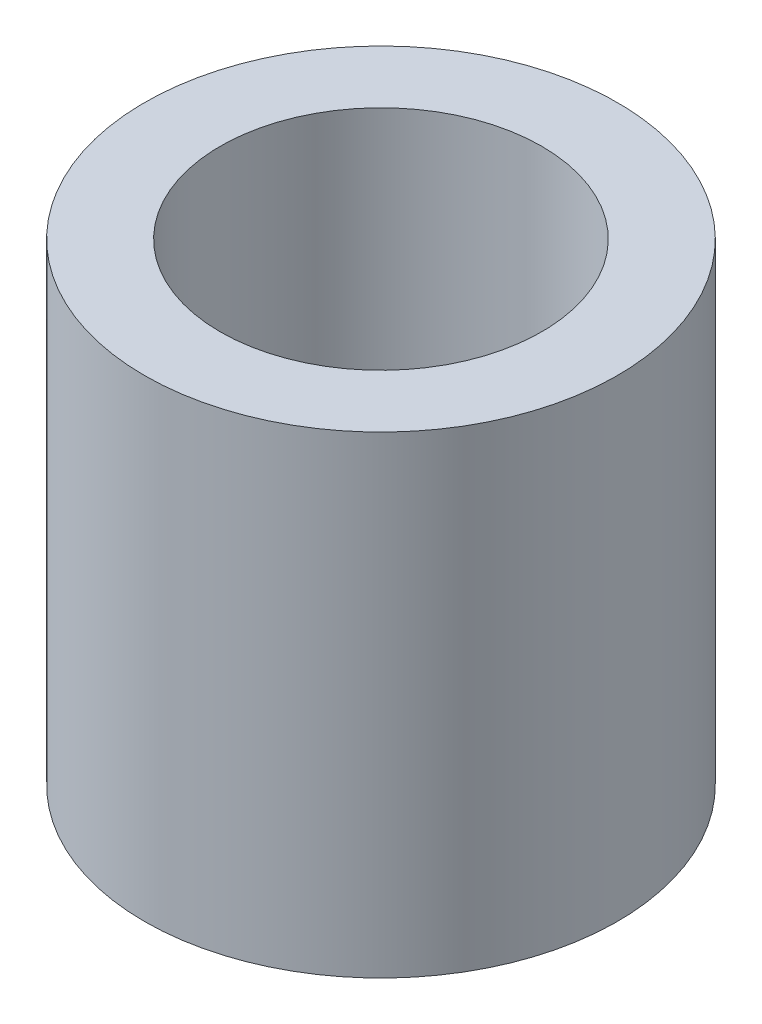
ISO-10303-21;
HEADER;
FILE_DESCRIPTION(('STEP AP214'),'2;1');
FILE_NAME('part.step','',(''),(''),'','','');
FILE_SCHEMA(('AUTOMOTIVE_DESIGN { 1 0 10303 214 1 1 1 1 }'));
ENDSEC;
DATA;
#1=APPLICATION_CONTEXT('core data for automotive mechanical design processes');
#2=APPLICATION_PROTOCOL_DEFINITION('international standard','automotive_design',2000,#1);
#3=PRODUCT_CONTEXT('',#1,'mechanical');
#4=PRODUCT('Part','Part','',(#3));
#5=PRODUCT_RELATED_PRODUCT_CATEGORY('part','',(#4));
#6=PRODUCT_DEFINITION_FORMATION('','',#4);
#7=PRODUCT_DEFINITION_CONTEXT('part definition',#1,'design');
#8=PRODUCT_DEFINITION('design','',#6,#7);
#9=PRODUCT_DEFINITION_SHAPE('','',#8);
#10=(LENGTH_UNIT() NAMED_UNIT(*) SI_UNIT(.MILLI.,.METRE.));
#11=(NAMED_UNIT(*) PLANE_ANGLE_UNIT() SI_UNIT($,.RADIAN.));
#12=(NAMED_UNIT(*) SI_UNIT($,.STERADIAN.) SOLID_ANGLE_UNIT());
#13=UNCERTAINTY_MEASURE_WITH_UNIT(LENGTH_MEASURE(1.E-05),#10,'distance_accuracy_value','');
#14=(GEOMETRIC_REPRESENTATION_CONTEXT(3) GLOBAL_UNCERTAINTY_ASSIGNED_CONTEXT((#13)) GLOBAL_UNIT_ASSIGNED_CONTEXT((#10,
#11,#12)) REPRESENTATION_CONTEXT('',''));
#15=CARTESIAN_POINT('',(0.,0.,0.));
#16=DIRECTION('',(0.,0.,1.));
#17=DIRECTION('',(1.,0.,0.));
#18=AXIS2_PLACEMENT_3D('',#15,#16,#17);
#19=CARTESIAN_POINT('',(0.,5.,0.));
#20=DIRECTION('',(0.,1.,0.));
#21=DIRECTION('',(0.,0.,1.));
#22=AXIS2_PLACEMENT_3D('',#19,#20,#21);
#23=PLANE('',#22);
#24=CARTESIAN_POINT('',(0.,5.,0.));
#25=DIRECTION('',(0.,1.,0.));
#26=DIRECTION('',(0.,0.,1.));
#27=AXIS2_PLACEMENT_3D('',#24,#25,#26);
#28=CIRCLE('',#27,2.5);
#29=CARTESIAN_POINT('',(0.,5.,2.5));
#30=VERTEX_POINT('',#29);
#31=EDGE_CURVE('E10',#30,#30,#28,.T.);
#32=ORIENTED_EDGE('',*,*,#31,.T.);
#33=EDGE_LOOP('',(#32));
#34=FACE_BOUND('',#33,.T.);
#35=CARTESIAN_POINT('',(0.,5.,0.));
#36=DIRECTION('',(0.,1.,0.));
#37=DIRECTION('',(0.,0.,1.));
#38=AXIS2_PLACEMENT_3D('',#35,#36,#37);
#39=CIRCLE('',#38,1.7);
#40=CARTESIAN_POINT('',(0.,5.,1.7));
#41=VERTEX_POINT('',#40);
#42=EDGE_CURVE('E46',#41,#41,#39,.T.);
#43=ORIENTED_EDGE('',*,*,#42,.F.);
#44=EDGE_LOOP('',(#43));
#45=FACE_BOUND('',#44,.T.);
#46=ADVANCED_FACE('F35',(#34,#45),#23,.T.);
#47=CARTESIAN_POINT('',(0.,0.,0.));
#48=DIRECTION('',(0.,1.,0.));
#49=DIRECTION('',(0.,0.,1.));
#50=AXIS2_PLACEMENT_3D('',#47,#48,#49);
#51=PLANE('',#50);
#52=CARTESIAN_POINT('',(0.,0.,0.));
#53=DIRECTION('',(0.,1.,0.));
#54=DIRECTION('',(0.,0.,1.));
#55=AXIS2_PLACEMENT_3D('',#52,#53,#54);
#56=CIRCLE('',#55,2.5);
#57=CARTESIAN_POINT('',(0.,0.,2.5));
#58=VERTEX_POINT('',#57);
#59=EDGE_CURVE('E39',#58,#58,#56,.T.);
#60=ORIENTED_EDGE('',*,*,#59,.F.);
#61=EDGE_LOOP('',(#60));
#62=FACE_BOUND('',#61,.T.);
#63=CARTESIAN_POINT('',(0.,0.,0.));
#64=DIRECTION('',(0.,1.,0.));
#65=DIRECTION('',(0.,0.,1.));
#66=AXIS2_PLACEMENT_3D('',#63,#64,#65);
#67=CIRCLE('',#66,1.7);
#68=CARTESIAN_POINT('',(0.,0.,1.7));
#69=VERTEX_POINT('',#68);
#70=EDGE_CURVE('E48',#69,#69,#67,.T.);
#71=ORIENTED_EDGE('',*,*,#70,.T.);
#72=EDGE_LOOP('',(#71));
#73=FACE_BOUND('',#72,.T.);
#74=ADVANCED_FACE('F58',(#62,#73),#51,.F.);
#75=CARTESIAN_POINT('',(0.,5.,0.));
#76=DIRECTION('',(0.,-1.,0.));
#77=DIRECTION('',(0.,0.,-1.));
#78=AXIS2_PLACEMENT_3D('',#75,#76,#77);
#79=CYLINDRICAL_SURFACE('',#78,2.5);
#80=ORIENTED_EDGE('',*,*,#31,.F.);
#81=EDGE_LOOP('',(#80));
#82=FACE_BOUND('',#81,.T.);
#83=ORIENTED_EDGE('',*,*,#59,.T.);
#84=EDGE_LOOP('',(#83));
#85=FACE_BOUND('',#84,.T.);
#86=ADVANCED_FACE('F37',(#82,#85),#79,.T.);
#87=CARTESIAN_POINT('',(0.,5.,0.));
#88=DIRECTION('',(0.,-1.,0.));
#89=DIRECTION('',(0.,0.,-1.));
#90=AXIS2_PLACEMENT_3D('',#87,#88,#89);
#91=CYLINDRICAL_SURFACE('',#90,1.7);
#92=ORIENTED_EDGE('',*,*,#42,.T.);
#93=EDGE_LOOP('',(#92));
#94=FACE_BOUND('',#93,.T.);
#95=ORIENTED_EDGE('',*,*,#70,.F.);
#96=EDGE_LOOP('',(#95));
#97=FACE_BOUND('',#96,.T.);
#98=ADVANCED_FACE('F54',(#94,#97),#91,.F.);
#99=CLOSED_SHELL('',(#46,#74,#86,#98));
#100=MANIFOLD_SOLID_BREP('B2',#99);
#101=ADVANCED_BREP_SHAPE_REPRESENTATION('',(#18,#100),#14);
#102=SHAPE_DEFINITION_REPRESENTATION(#9,#101);
ENDSEC;
END-ISO-10303-21;
